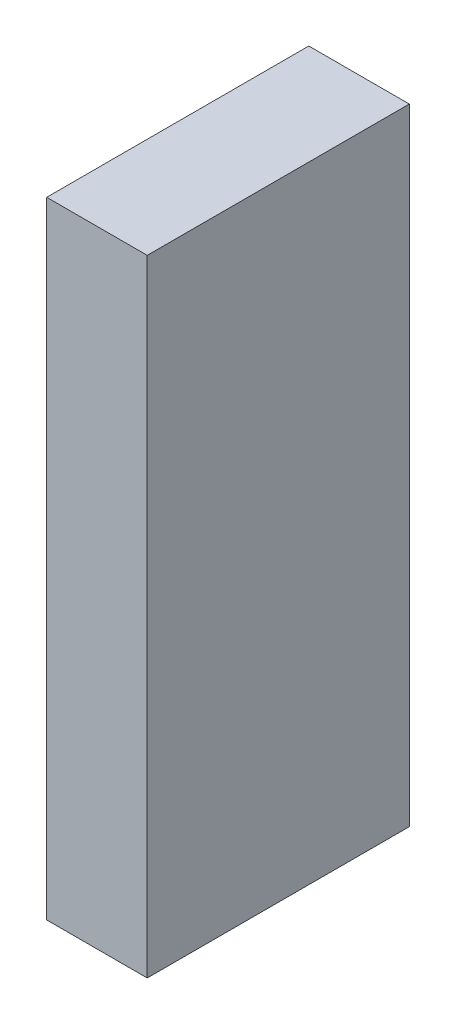
ISO-10303-21;
HEADER;
FILE_DESCRIPTION(('STEP AP214'),'2;1');
FILE_NAME('part.step','',(''),(''),'','','');
FILE_SCHEMA(('AUTOMOTIVE_DESIGN { 1 0 10303 214 1 1 1 1 }'));
ENDSEC;
DATA;
#1=APPLICATION_CONTEXT('core data for automotive mechanical design processes');
#2=APPLICATION_PROTOCOL_DEFINITION('international standard','automotive_design',2000,#1);
#3=PRODUCT_CONTEXT('',#1,'mechanical');
#4=PRODUCT('Part','Part','',(#3));
#5=PRODUCT_RELATED_PRODUCT_CATEGORY('part','',(#4));
#6=PRODUCT_DEFINITION_FORMATION('','',#4);
#7=PRODUCT_DEFINITION_CONTEXT('part definition',#1,'design');
#8=PRODUCT_DEFINITION('design','',#6,#7);
#9=PRODUCT_DEFINITION_SHAPE('','',#8);
#10=(LENGTH_UNIT() NAMED_UNIT(*) SI_UNIT(.MILLI.,.METRE.));
#11=(NAMED_UNIT(*) PLANE_ANGLE_UNIT() SI_UNIT($,.RADIAN.));
#12=(NAMED_UNIT(*) SI_UNIT($,.STERADIAN.) SOLID_ANGLE_UNIT());
#13=UNCERTAINTY_MEASURE_WITH_UNIT(LENGTH_MEASURE(1.E-05),#10,'distance_accuracy_value','');
#14=(GEOMETRIC_REPRESENTATION_CONTEXT(3) GLOBAL_UNCERTAINTY_ASSIGNED_CONTEXT((#13)) GLOBAL_UNIT_ASSIGNED_CONTEXT((#10,
#11,#12)) REPRESENTATION_CONTEXT('',''));
#15=CARTESIAN_POINT('',(0.,0.,0.));
#16=DIRECTION('',(0.,0.,1.));
#17=DIRECTION('',(1.,0.,0.));
#18=AXIS2_PLACEMENT_3D('',#15,#16,#17);
#19=CARTESIAN_POINT('',(-1.2849987,8.00049962,0.));
#20=DIRECTION('',(0.,1.,0.));
#21=DIRECTION('',(1.,0.,0.));
#22=AXIS2_PLACEMENT_3D('',#19,#20,#21);
#23=PLANE('',#22);
#24=DIRECTION('',(0.,0.,1.));
#25=VECTOR('',#24,1.);
#26=CARTESIAN_POINT('',(-1.2849987,8.00049962,0.));
#27=LINE('',#26,#25);
#28=CARTESIAN_POINT('',(-1.2849987,8.00049962,0.));
#29=VERTEX_POINT('',#28);
#30=CARTESIAN_POINT('',(-1.2849987,8.00049962,6.6999993));
#31=VERTEX_POINT('',#30);
#32=EDGE_CURVE('E11',#29,#31,#27,.T.);
#33=ORIENTED_EDGE('',*,*,#32,.T.);
#34=DIRECTION('',(1.,0.,0.));
#35=VECTOR('',#34,1.);
#36=CARTESIAN_POINT('',(-1.2849987,8.00049962,6.6999993));
#37=LINE('',#36,#35);
#38=CARTESIAN_POINT('',(1.28500124,8.00049962,6.6999993));
#39=VERTEX_POINT('',#38);
#40=EDGE_CURVE('E28',#31,#39,#37,.T.);
#41=ORIENTED_EDGE('',*,*,#40,.T.);
#42=DIRECTION('',(0.,0.,1.));
#43=VECTOR('',#42,1.);
#44=CARTESIAN_POINT('',(1.28500124,8.00049962,0.));
#45=LINE('',#44,#43);
#46=CARTESIAN_POINT('',(1.28500124,8.00049962,0.));
#47=VERTEX_POINT('',#46);
#48=EDGE_CURVE('E108',#47,#39,#45,.T.);
#49=ORIENTED_EDGE('',*,*,#48,.F.);
#50=DIRECTION('',(1.,0.,0.));
#51=VECTOR('',#50,1.);
#52=CARTESIAN_POINT('',(-1.2849987,8.00049962,0.));
#53=LINE('',#52,#51);
#54=EDGE_CURVE('E21',#29,#47,#53,.T.);
#55=ORIENTED_EDGE('',*,*,#54,.F.);
#56=EDGE_LOOP('',(#33,#41,#49,#55));
#57=FACE_BOUND('',#56,.T.);
#58=ADVANCED_FACE('F17',(#57),#23,.T.);
#59=CARTESIAN_POINT('',(1.28500124,8.00049962,0.));
#60=DIRECTION('',(1.,0.,0.));
#61=DIRECTION('',(0.,1.,0.));
#62=AXIS2_PLACEMENT_3D('',#59,#60,#61);
#63=PLANE('',#62);
#64=ORIENTED_EDGE('',*,*,#48,.T.);
#65=DIRECTION('',(0.,-1.,0.));
#66=VECTOR('',#65,1.);
#67=CARTESIAN_POINT('',(1.28500124,8.00049962,6.6999993));
#68=LINE('',#67,#66);
#69=CARTESIAN_POINT('',(1.28500124,-8.00049962,6.6999993));
#70=VERTEX_POINT('',#69);
#71=EDGE_CURVE('E89',#39,#70,#68,.T.);
#72=ORIENTED_EDGE('',*,*,#71,.T.);
#73=DIRECTION('',(0.,0.,1.));
#74=VECTOR('',#73,1.);
#75=CARTESIAN_POINT('',(1.28500124,-8.00049962,0.));
#76=LINE('',#75,#74);
#77=CARTESIAN_POINT('',(1.28500124,-8.00049962,0.));
#78=VERTEX_POINT('',#77);
#79=EDGE_CURVE('E87',#78,#70,#76,.T.);
#80=ORIENTED_EDGE('',*,*,#79,.F.);
#81=DIRECTION('',(0.,-1.,0.));
#82=VECTOR('',#81,1.);
#83=CARTESIAN_POINT('',(1.28500124,8.00049962,0.));
#84=LINE('',#83,#82);
#85=EDGE_CURVE('E75',#47,#78,#84,.T.);
#86=ORIENTED_EDGE('',*,*,#85,.F.);
#87=EDGE_LOOP('',(#64,#72,#80,#86));
#88=FACE_BOUND('',#87,.T.);
#89=ADVANCED_FACE('F88',(#88),#63,.T.);
#90=CARTESIAN_POINT('',(1.28500124,-8.00049962,0.));
#91=DIRECTION('',(0.,-1.,0.));
#92=DIRECTION('',(0.,0.,-1.));
#93=AXIS2_PLACEMENT_3D('',#90,#91,#92);
#94=PLANE('',#93);
#95=ORIENTED_EDGE('',*,*,#79,.T.);
#96=DIRECTION('',(-1.,0.,0.));
#97=VECTOR('',#96,1.);
#98=CARTESIAN_POINT('',(1.28500124,-8.00049962,6.6999993));
#99=LINE('',#98,#97);
#100=CARTESIAN_POINT('',(-1.28399794,-8.00049962,6.6999993));
#101=VERTEX_POINT('',#100);
#102=EDGE_CURVE('E94',#70,#101,#99,.T.);
#103=ORIENTED_EDGE('',*,*,#102,.T.);
#104=DIRECTION('',(0.,0.,1.));
#105=VECTOR('',#104,1.);
#106=CARTESIAN_POINT('',(-1.28399794,-8.00049962,0.));
#107=LINE('',#106,#105);
#108=CARTESIAN_POINT('',(-1.28399794,-8.00049962,0.));
#109=VERTEX_POINT('',#108);
#110=EDGE_CURVE('E95',#109,#101,#107,.T.);
#111=ORIENTED_EDGE('',*,*,#110,.F.);
#112=DIRECTION('',(-1.,0.,0.));
#113=VECTOR('',#112,1.);
#114=CARTESIAN_POINT('',(1.28500124,-8.00049962,0.));
#115=LINE('',#114,#113);
#116=EDGE_CURVE('E79',#78,#109,#115,.T.);
#117=ORIENTED_EDGE('',*,*,#116,.F.);
#118=EDGE_LOOP('',(#95,#103,#111,#117));
#119=FACE_BOUND('',#118,.T.);
#120=ADVANCED_FACE('F19',(#119),#94,.T.);
#121=CARTESIAN_POINT('',(-1.28399794,-8.00049962,0.));
#122=DIRECTION('',(-0.707106781196548,-0.707106781176548,0.));
#123=DIRECTION('',(-0.707106781176548,0.707106781196548,0.));
#124=AXIS2_PLACEMENT_3D('',#121,#122,#123);
#125=PLANE('',#124);
#126=ORIENTED_EDGE('',*,*,#110,.T.);
#127=DIRECTION('',(-0.707106781176548,0.707106781196548,0.));
#128=VECTOR('',#127,1.);
#129=CARTESIAN_POINT('',(-1.28399794,-8.00049962,6.6999993));
#130=LINE('',#129,#128);
#131=CARTESIAN_POINT('',(-1.2849987,-7.99949886,6.6999993));
#132=VERTEX_POINT('',#131);
#133=EDGE_CURVE('E112',#101,#132,#130,.T.);
#134=ORIENTED_EDGE('',*,*,#133,.T.);
#135=DIRECTION('',(0.,0.,1.));
#136=VECTOR('',#135,1.);
#137=CARTESIAN_POINT('',(-1.2849987,-7.99949886,0.));
#138=LINE('',#137,#136);
#139=CARTESIAN_POINT('',(-1.2849987,-7.99949886,0.));
#140=VERTEX_POINT('',#139);
#141=EDGE_CURVE('E109',#140,#132,#138,.T.);
#142=ORIENTED_EDGE('',*,*,#141,.F.);
#143=DIRECTION('',(-0.707106781176548,0.707106781196548,0.));
#144=VECTOR('',#143,1.);
#145=CARTESIAN_POINT('',(-1.28399794,-8.00049962,0.));
#146=LINE('',#145,#144);
#147=EDGE_CURVE('E98',#109,#140,#146,.T.);
#148=ORIENTED_EDGE('',*,*,#147,.F.);
#149=EDGE_LOOP('',(#126,#134,#142,#148));
#150=FACE_BOUND('',#149,.T.);
#151=ADVANCED_FACE('F141',(#150),#125,.T.);
#152=CARTESIAN_POINT('',(-1.2849987,-7.99949886,0.));
#153=DIRECTION('',(-1.,0.,0.));
#154=DIRECTION('',(0.,0.,1.));
#155=AXIS2_PLACEMENT_3D('',#152,#153,#154);
#156=PLANE('',#155);
#157=ORIENTED_EDGE('',*,*,#141,.T.);
#158=DIRECTION('',(0.,1.,0.));
#159=VECTOR('',#158,1.);
#160=CARTESIAN_POINT('',(-1.2849987,-7.99949886,6.6999993));
#161=LINE('',#160,#159);
#162=EDGE_CURVE('E113',#132,#31,#161,.T.);
#163=ORIENTED_EDGE('',*,*,#162,.T.);
#164=ORIENTED_EDGE('',*,*,#32,.F.);
#165=DIRECTION('',(0.,1.,0.));
#166=VECTOR('',#165,1.);
#167=CARTESIAN_POINT('',(-1.2849987,-7.99949886,0.));
#168=LINE('',#167,#166);
#169=EDGE_CURVE('E103',#140,#29,#168,.T.);
#170=ORIENTED_EDGE('',*,*,#169,.F.);
#171=EDGE_LOOP('',(#157,#163,#164,#170));
#172=FACE_BOUND('',#171,.T.);
#173=ADVANCED_FACE('F194',(#172),#156,.T.);
#174=CARTESIAN_POINT('',(-1.2849987,8.00049962,0.));
#175=DIRECTION('',(0.,0.,1.));
#176=DIRECTION('',(1.,0.,0.));
#177=AXIS2_PLACEMENT_3D('',#174,#175,#176);
#178=PLANE('',#177);
#179=ORIENTED_EDGE('',*,*,#54,.T.);
#180=ORIENTED_EDGE('',*,*,#85,.T.);
#181=ORIENTED_EDGE('',*,*,#116,.T.);
#182=ORIENTED_EDGE('',*,*,#147,.T.);
#183=ORIENTED_EDGE('',*,*,#169,.T.);
#184=EDGE_LOOP('',(#179,#180,#181,#182,#183));
#185=FACE_BOUND('',#184,.T.);
#186=ADVANCED_FACE('F77',(#185),#178,.F.);
#187=CARTESIAN_POINT('',(-1.2849987,8.00049962,6.6999993));
#188=DIRECTION('',(0.,0.,1.));
#189=DIRECTION('',(1.,0.,0.));
#190=AXIS2_PLACEMENT_3D('',#187,#188,#189);
#191=PLANE('',#190);
#192=ORIENTED_EDGE('',*,*,#162,.F.);
#193=ORIENTED_EDGE('',*,*,#133,.F.);
#194=ORIENTED_EDGE('',*,*,#102,.F.);
#195=ORIENTED_EDGE('',*,*,#71,.F.);
#196=ORIENTED_EDGE('',*,*,#40,.F.);
#197=EDGE_LOOP('',(#192,#193,#194,#195,#196));
#198=FACE_BOUND('',#197,.T.);
#199=ADVANCED_FACE('F138',(#198),#191,.T.);
#200=CLOSED_SHELL('',(#58,#89,#120,#151,#173,#186,#199));
#201=MANIFOLD_SOLID_BREP('B1',#200);
#202=ADVANCED_BREP_SHAPE_REPRESENTATION('',(#18,#201),#14);
#203=SHAPE_DEFINITION_REPRESENTATION(#9,#202);
ENDSEC;
END-ISO-10303-21;
